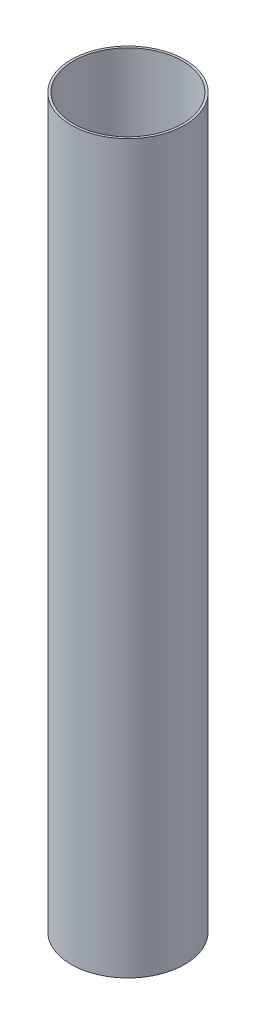
ISO-10303-21;
HEADER;
FILE_DESCRIPTION(('STEP AP214'),'2;1');
FILE_NAME('part.step','',(''),(''),'','','');
FILE_SCHEMA(('AUTOMOTIVE_DESIGN { 1 0 10303 214 1 1 1 1 }'));
ENDSEC;
DATA;
#1=APPLICATION_CONTEXT('core data for automotive mechanical design processes');
#2=APPLICATION_PROTOCOL_DEFINITION('international standard','automotive_design',2000,#1);
#3=PRODUCT_CONTEXT('',#1,'mechanical');
#4=PRODUCT('Part','Part','',(#3));
#5=PRODUCT_RELATED_PRODUCT_CATEGORY('part','',(#4));
#6=PRODUCT_DEFINITION_FORMATION('','',#4);
#7=PRODUCT_DEFINITION_CONTEXT('part definition',#1,'design');
#8=PRODUCT_DEFINITION('design','',#6,#7);
#9=PRODUCT_DEFINITION_SHAPE('','',#8);
#10=(LENGTH_UNIT() NAMED_UNIT(*) SI_UNIT(.MILLI.,.METRE.));
#11=(NAMED_UNIT(*) PLANE_ANGLE_UNIT() SI_UNIT($,.RADIAN.));
#12=(NAMED_UNIT(*) SI_UNIT($,.STERADIAN.) SOLID_ANGLE_UNIT());
#13=UNCERTAINTY_MEASURE_WITH_UNIT(LENGTH_MEASURE(1.E-05),#10,'distance_accuracy_value','');
#14=(GEOMETRIC_REPRESENTATION_CONTEXT(3) GLOBAL_UNCERTAINTY_ASSIGNED_CONTEXT((#13)) GLOBAL_UNIT_ASSIGNED_CONTEXT((#10,
#11,#12)) REPRESENTATION_CONTEXT('',''));
#15=CARTESIAN_POINT('',(0.,0.,0.));
#16=DIRECTION('',(0.,0.,1.));
#17=DIRECTION('',(1.,0.,0.));
#18=AXIS2_PLACEMENT_3D('',#15,#16,#17);
#19=CARTESIAN_POINT('',(0.,254.,0.));
#20=DIRECTION('',(0.,1.,0.));
#21=DIRECTION('',(0.,0.,1.));
#22=AXIS2_PLACEMENT_3D('',#19,#20,#21);
#23=PLANE('',#22);
#24=CARTESIAN_POINT('',(0.,254.,0.));
#25=DIRECTION('',(0.,1.,0.));
#26=DIRECTION('',(0.,0.,1.));
#27=AXIS2_PLACEMENT_3D('',#24,#25,#26);
#28=CIRCLE('',#27,39.6748);
#29=CARTESIAN_POINT('',(0.,254.,39.6748));
#30=VERTEX_POINT('',#29);
#31=EDGE_CURVE('E10',#30,#30,#28,.T.);
#32=ORIENTED_EDGE('',*,*,#31,.T.);
#33=EDGE_LOOP('',(#32));
#34=FACE_BOUND('',#33,.T.);
#35=CARTESIAN_POINT('',(0.,254.,0.));
#36=DIRECTION('',(0.,1.,0.));
#37=DIRECTION('',(0.,0.,1.));
#38=AXIS2_PLACEMENT_3D('',#35,#36,#37);
#39=CIRCLE('',#38,38.1);
#40=CARTESIAN_POINT('',(0.,254.,38.1));
#41=VERTEX_POINT('',#40);
#42=EDGE_CURVE('E50',#41,#41,#39,.T.);
#43=ORIENTED_EDGE('',*,*,#42,.F.);
#44=EDGE_LOOP('',(#43));
#45=FACE_BOUND('',#44,.T.);
#46=ADVANCED_FACE('F37',(#34,#45),#23,.T.);
#47=CARTESIAN_POINT('',(0.,-254.,0.));
#48=DIRECTION('',(0.,1.,0.));
#49=DIRECTION('',(0.,0.,1.));
#50=AXIS2_PLACEMENT_3D('',#47,#48,#49);
#51=PLANE('',#50);
#52=CARTESIAN_POINT('',(0.,-254.,0.));
#53=DIRECTION('',(0.,1.,0.));
#54=DIRECTION('',(0.,0.,1.));
#55=AXIS2_PLACEMENT_3D('',#52,#53,#54);
#56=CIRCLE('',#55,39.6748);
#57=CARTESIAN_POINT('',(0.,-254.,39.6748));
#58=VERTEX_POINT('',#57);
#59=EDGE_CURVE('E41',#58,#58,#56,.T.);
#60=ORIENTED_EDGE('',*,*,#59,.F.);
#61=EDGE_LOOP('',(#60));
#62=FACE_BOUND('',#61,.T.);
#63=CARTESIAN_POINT('',(0.,-254.,0.));
#64=DIRECTION('',(0.,1.,0.));
#65=DIRECTION('',(0.,0.,1.));
#66=AXIS2_PLACEMENT_3D('',#63,#64,#65);
#67=CIRCLE('',#66,38.1);
#68=CARTESIAN_POINT('',(0.,-254.,38.1));
#69=VERTEX_POINT('',#68);
#70=EDGE_CURVE('E52',#69,#69,#67,.T.);
#71=ORIENTED_EDGE('',*,*,#70,.T.);
#72=EDGE_LOOP('',(#71));
#73=FACE_BOUND('',#72,.T.);
#74=ADVANCED_FACE('F64',(#62,#73),#51,.F.);
#75=CARTESIAN_POINT('',(0.,254.,0.));
#76=DIRECTION('',(0.,-1.,0.));
#77=DIRECTION('',(0.,0.,-1.));
#78=AXIS2_PLACEMENT_3D('',#75,#76,#77);
#79=CYLINDRICAL_SURFACE('',#78,39.6748);
#80=ORIENTED_EDGE('',*,*,#31,.F.);
#81=EDGE_LOOP('',(#80));
#82=FACE_BOUND('',#81,.T.);
#83=ORIENTED_EDGE('',*,*,#59,.T.);
#84=EDGE_LOOP('',(#83));
#85=FACE_BOUND('',#84,.T.);
#86=ADVANCED_FACE('F39',(#82,#85),#79,.T.);
#87=CARTESIAN_POINT('',(0.,254.,0.));
#88=DIRECTION('',(0.,-1.,0.));
#89=DIRECTION('',(0.,0.,-1.));
#90=AXIS2_PLACEMENT_3D('',#87,#88,#89);
#91=CYLINDRICAL_SURFACE('',#90,38.1);
#92=ORIENTED_EDGE('',*,*,#42,.T.);
#93=EDGE_LOOP('',(#92));
#94=FACE_BOUND('',#93,.T.);
#95=ORIENTED_EDGE('',*,*,#70,.F.);
#96=EDGE_LOOP('',(#95));
#97=FACE_BOUND('',#96,.T.);
#98=ADVANCED_FACE('F60',(#94,#97),#91,.F.);
#99=CLOSED_SHELL('',(#46,#74,#86,#98));
#100=MANIFOLD_SOLID_BREP('B2',#99);
#101=ADVANCED_BREP_SHAPE_REPRESENTATION('',(#18,#100),#14);
#102=SHAPE_DEFINITION_REPRESENTATION(#9,#101);
ENDSEC;
END-ISO-10303-21;
